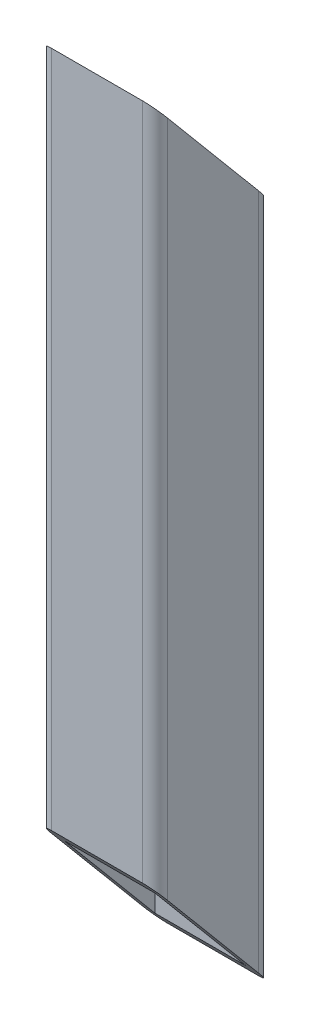
ISO-10303-21;
HEADER;
FILE_DESCRIPTION(('STEP AP214'),'2;1');
FILE_NAME('part.step','',(''),(''),'','','');
FILE_SCHEMA(('AUTOMOTIVE_DESIGN { 1 0 10303 214 1 1 1 1 }'));
ENDSEC;
DATA;
#1=APPLICATION_CONTEXT('core data for automotive mechanical design processes');
#2=APPLICATION_PROTOCOL_DEFINITION('international standard','automotive_design',2000,#1);
#3=PRODUCT_CONTEXT('',#1,'mechanical');
#4=PRODUCT('Part','Part','',(#3));
#5=PRODUCT_RELATED_PRODUCT_CATEGORY('part','',(#4));
#6=PRODUCT_DEFINITION_FORMATION('','',#4);
#7=PRODUCT_DEFINITION_CONTEXT('part definition',#1,'design');
#8=PRODUCT_DEFINITION('design','',#6,#7);
#9=PRODUCT_DEFINITION_SHAPE('','',#8);
#10=(LENGTH_UNIT() NAMED_UNIT(*) SI_UNIT(.MILLI.,.METRE.));
#11=(NAMED_UNIT(*) PLANE_ANGLE_UNIT() SI_UNIT($,.RADIAN.));
#12=(NAMED_UNIT(*) SI_UNIT($,.STERADIAN.) SOLID_ANGLE_UNIT());
#13=UNCERTAINTY_MEASURE_WITH_UNIT(LENGTH_MEASURE(1.E-05),#10,'distance_accuracy_value','');
#14=(GEOMETRIC_REPRESENTATION_CONTEXT(3) GLOBAL_UNCERTAINTY_ASSIGNED_CONTEXT((#13)) GLOBAL_UNIT_ASSIGNED_CONTEXT((#10,
#11,#12)) REPRESENTATION_CONTEXT('',''));
#15=CARTESIAN_POINT('',(0.,0.,0.));
#16=DIRECTION('',(0.,0.,1.));
#17=DIRECTION('',(1.,0.,0.));
#18=AXIS2_PLACEMENT_3D('',#15,#16,#17);
#19=CARTESIAN_POINT('',(22.8,180.,2.8));
#20=DIRECTION('',(0.,-1.,0.));
#21=DIRECTION('',(0.,0.,-1.));
#22=AXIS2_PLACEMENT_3D('',#19,#20,#21);
#23=CYLINDRICAL_SURFACE('',#22,2.8);
#24=CARTESIAN_POINT('',(22.8,152.816702139194,2.8));
#25=DIRECTION('',(0.,0.642630545799381,-0.766176207934957));
#26=DIRECTION('',(0.,-0.766176207934957,-0.642630545799381));
#27=AXIS2_PLACEMENT_3D('',#24,#25,#26);
#28=ELLIPSE('',#27,4.3570913619069,2.8);
#29=CARTESIAN_POINT('',(25.6,152.816702139194,2.80000000000002));
#30=VERTEX_POINT('',#29);
#31=CARTESIAN_POINT('',(22.8,149.478402401902,0.));
#32=VERTEX_POINT('',#31);
#33=EDGE_CURVE('E235',#30,#32,#28,.T.);
#34=ORIENTED_EDGE('',*,*,#33,.F.);
#35=DIRECTION('',(0.,-1.,0.));
#36=VECTOR('',#35,1.);
#37=CARTESIAN_POINT('',(25.6,180.,2.80000000000002));
#38=LINE('',#37,#36);
#39=CARTESIAN_POINT('',(25.6,3.33691005926381,2.80000000000004));
#40=VERTEX_POINT('',#39);
#41=EDGE_CURVE('E145',#30,#40,#38,.T.);
#42=ORIENTED_EDGE('',*,*,#41,.T.);
#43=CARTESIAN_POINT('',(22.8,3.33691005926376,2.8));
#44=DIRECTION('',(0.,-0.642787609686543,0.766044443118975));
#45=DIRECTION('',(0.,-0.766044443118975,-0.642787609686543));
#46=AXIS2_PLACEMENT_3D('',#43,#44,#45);
#47=ELLIPSE('',#46,4.35602671520913,2.8);
#48=CARTESIAN_POINT('',(22.8,0.,0.));
#49=VERTEX_POINT('',#48);
#50=EDGE_CURVE('E178',#49,#40,#47,.T.);
#51=ORIENTED_EDGE('',*,*,#50,.F.);
#52=DIRECTION('',(0.,-1.,0.));
#53=VECTOR('',#52,1.);
#54=CARTESIAN_POINT('',(22.8,180.,0.));
#55=LINE('',#54,#53);
#56=EDGE_CURVE('E41',#32,#49,#55,.T.);
#57=ORIENTED_EDGE('',*,*,#56,.F.);
#58=EDGE_LOOP('',(#34,#42,#51,#57));
#59=FACE_BOUND('',#58,.T.);
#60=ADVANCED_FACE('F34',(#59),#23,.T.);
#61=CARTESIAN_POINT('',(2.8,180.,2.8));
#62=DIRECTION('',(0.,-1.,0.));
#63=DIRECTION('',(0.,0.,-1.));
#64=AXIS2_PLACEMENT_3D('',#61,#62,#63);
#65=CYLINDRICAL_SURFACE('',#64,2.8);
#66=CARTESIAN_POINT('',(2.8,152.816702139194,2.8));
#67=DIRECTION('',(0.,0.642630545799381,-0.766176207934957));
#68=DIRECTION('',(0.,-0.766176207934957,-0.642630545799381));
#69=AXIS2_PLACEMENT_3D('',#66,#67,#68);
#70=ELLIPSE('',#69,4.3570913619069,2.8);
#71=CARTESIAN_POINT('',(2.80000000000002,149.478402401902,0.));
#72=VERTEX_POINT('',#71);
#73=CARTESIAN_POINT('',(0.,152.816702139194,2.80000000000002));
#74=VERTEX_POINT('',#73);
#75=EDGE_CURVE('E234',#72,#74,#70,.T.);
#76=ORIENTED_EDGE('',*,*,#75,.F.);
#77=DIRECTION('',(0.,-1.,0.));
#78=VECTOR('',#77,1.);
#79=CARTESIAN_POINT('',(2.80000000000002,180.,0.));
#80=LINE('',#79,#78);
#81=CARTESIAN_POINT('',(2.80000000000002,0.,0.));
#82=VERTEX_POINT('',#81);
#83=EDGE_CURVE('E162',#72,#82,#80,.T.);
#84=ORIENTED_EDGE('',*,*,#83,.T.);
#85=CARTESIAN_POINT('',(2.8,3.33691005926376,2.8));
#86=DIRECTION('',(0.,-0.642787609686543,0.766044443118975));
#87=DIRECTION('',(0.,-0.766044443118975,-0.642787609686543));
#88=AXIS2_PLACEMENT_3D('',#85,#86,#87);
#89=ELLIPSE('',#88,4.35602671520913,2.8);
#90=CARTESIAN_POINT('',(0.,3.33691005926381,2.80000000000004));
#91=VERTEX_POINT('',#90);
#92=EDGE_CURVE('E182',#91,#82,#89,.T.);
#93=ORIENTED_EDGE('',*,*,#92,.F.);
#94=DIRECTION('',(0.,-1.,0.));
#95=VECTOR('',#94,1.);
#96=CARTESIAN_POINT('',(0.,180.,2.80000000000002));
#97=LINE('',#96,#95);
#98=EDGE_CURVE('E160',#74,#91,#97,.T.);
#99=ORIENTED_EDGE('',*,*,#98,.F.);
#100=EDGE_LOOP('',(#76,#84,#93,#99));
#101=FACE_BOUND('',#100,.T.);
#102=ADVANCED_FACE('F232',(#101),#65,.T.);
#103=CARTESIAN_POINT('',(0.,180.,2.80000000000002));
#104=DIRECTION('',(1.,0.,0.));
#105=DIRECTION('',(0.,0.,-1.));
#106=AXIS2_PLACEMENT_3D('',#103,#104,#105);
#107=PLANE('',#106);
#108=DIRECTION('',(0.,0.766176207934957,0.642630545799381));
#109=VECTOR('',#108,1.);
#110=CARTESIAN_POINT('',(0.,168.774004249211,16.1841923806075));
#111=LINE('',#110,#109);
#112=CARTESIAN_POINT('',(0.,176.661700262708,22.8));
#113=VERTEX_POINT('',#112);
#114=EDGE_CURVE('E48',#74,#113,#111,.T.);
#115=ORIENTED_EDGE('',*,*,#114,.F.);
#116=ORIENTED_EDGE('',*,*,#98,.T.);
#117=DIRECTION('',(0.,-0.766044443118975,-0.642787609686543));
#118=VECTOR('',#117,1.);
#119=CARTESIAN_POINT('',(0.,107.00706684424,89.7895903223652));
#120=LINE('',#119,#118);
#121=CARTESIAN_POINT('',(0.,27.1719819111478,22.8));
#122=VERTEX_POINT('',#121);
#123=EDGE_CURVE('E186',#122,#91,#120,.T.);
#124=ORIENTED_EDGE('',*,*,#123,.F.);
#125=DIRECTION('',(0.,-1.,0.));
#126=VECTOR('',#125,1.);
#127=CARTESIAN_POINT('',(0.,180.,22.8));
#128=LINE('',#127,#126);
#129=EDGE_CURVE('E158',#113,#122,#128,.T.);
#130=ORIENTED_EDGE('',*,*,#129,.F.);
#131=EDGE_LOOP('',(#115,#116,#124,#130));
#132=FACE_BOUND('',#131,.T.);
#133=ADVANCED_FACE('F266',(#132),#107,.F.);
#134=CARTESIAN_POINT('',(2.8,180.,22.8));
#135=DIRECTION('',(0.,-1.,0.));
#136=DIRECTION('',(0.,0.,-1.));
#137=AXIS2_PLACEMENT_3D('',#134,#135,#136);
#138=CYLINDRICAL_SURFACE('',#137,2.8);
#139=CARTESIAN_POINT('',(2.8,176.661700262708,22.8));
#140=DIRECTION('',(0.,0.642630545799381,-0.766176207934957));
#141=DIRECTION('',(0.,-0.766176207934957,-0.642630545799381));
#142=AXIS2_PLACEMENT_3D('',#139,#140,#141);
#143=ELLIPSE('',#142,4.3570913619069,2.8);
#144=CARTESIAN_POINT('',(2.80000000000002,180.,25.6));
#145=VERTEX_POINT('',#144);
#146=EDGE_CURVE('E56',#113,#145,#143,.T.);
#147=ORIENTED_EDGE('',*,*,#146,.F.);
#148=ORIENTED_EDGE('',*,*,#129,.T.);
#149=CARTESIAN_POINT('',(2.8,27.1719819111478,22.8));
#150=DIRECTION('',(0.,-0.642787609686543,0.766044443118975));
#151=DIRECTION('',(0.,-0.766044443118975,-0.642787609686543));
#152=AXIS2_PLACEMENT_3D('',#149,#150,#151);
#153=ELLIPSE('',#152,4.35602671520913,2.8);
#154=CARTESIAN_POINT('',(2.80000000000002,30.5088919704115,25.6));
#155=VERTEX_POINT('',#154);
#156=EDGE_CURVE('E227',#155,#122,#153,.T.);
#157=ORIENTED_EDGE('',*,*,#156,.F.);
#158=DIRECTION('',(0.,-1.,0.));
#159=VECTOR('',#158,1.);
#160=CARTESIAN_POINT('',(2.80000000000002,180.,25.6));
#161=LINE('',#160,#159);
#162=EDGE_CURVE('E132',#145,#155,#161,.T.);
#163=ORIENTED_EDGE('',*,*,#162,.F.);
#164=EDGE_LOOP('',(#147,#148,#157,#163));
#165=FACE_BOUND('',#164,.T.);
#166=ADVANCED_FACE('F271',(#165),#138,.T.);
#167=CARTESIAN_POINT('',(22.8,180.,22.8));
#168=DIRECTION('',(0.,-1.,0.));
#169=DIRECTION('',(0.,0.,-1.));
#170=AXIS2_PLACEMENT_3D('',#167,#168,#169);
#171=CYLINDRICAL_SURFACE('',#170,2.8);
#172=CARTESIAN_POINT('',(22.8,176.661700262708,22.8));
#173=DIRECTION('',(0.,0.642630545799381,-0.766176207934957));
#174=DIRECTION('',(0.,-0.766176207934957,-0.642630545799381));
#175=AXIS2_PLACEMENT_3D('',#172,#173,#174);
#176=ELLIPSE('',#175,4.3570913619069,2.8);
#177=CARTESIAN_POINT('',(22.8,180.,25.6));
#178=VERTEX_POINT('',#177);
#179=CARTESIAN_POINT('',(25.6,176.661700262708,22.8));
#180=VERTEX_POINT('',#179);
#181=EDGE_CURVE('E137',#178,#180,#176,.T.);
#182=ORIENTED_EDGE('',*,*,#181,.F.);
#183=DIRECTION('',(0.,-1.,0.));
#184=VECTOR('',#183,1.);
#185=CARTESIAN_POINT('',(22.8,180.,25.6));
#186=LINE('',#185,#184);
#187=CARTESIAN_POINT('',(22.8,30.5088919704115,25.6));
#188=VERTEX_POINT('',#187);
#189=EDGE_CURVE('E123',#178,#188,#186,.T.);
#190=ORIENTED_EDGE('',*,*,#189,.T.);
#191=CARTESIAN_POINT('',(22.8,27.1719819111478,22.8));
#192=DIRECTION('',(0.,-0.642787609686543,0.766044443118975));
#193=DIRECTION('',(0.,-0.766044443118975,-0.642787609686543));
#194=AXIS2_PLACEMENT_3D('',#191,#192,#193);
#195=ELLIPSE('',#194,4.35602671520913,2.8);
#196=CARTESIAN_POINT('',(25.6,27.1719819111477,22.8));
#197=VERTEX_POINT('',#196);
#198=EDGE_CURVE('E224',#197,#188,#195,.T.);
#199=ORIENTED_EDGE('',*,*,#198,.F.);
#200=DIRECTION('',(0.,-1.,0.));
#201=VECTOR('',#200,1.);
#202=CARTESIAN_POINT('',(25.6,180.,22.8));
#203=LINE('',#202,#201);
#204=EDGE_CURVE('E133',#180,#197,#203,.T.);
#205=ORIENTED_EDGE('',*,*,#204,.F.);
#206=EDGE_LOOP('',(#182,#190,#199,#205));
#207=FACE_BOUND('',#206,.T.);
#208=ADVANCED_FACE('F138',(#207),#171,.T.);
#209=CARTESIAN_POINT('',(25.6,180.,2.80000000000002));
#210=DIRECTION('',(-1.,0.,0.));
#211=DIRECTION('',(0.,0.,1.));
#212=AXIS2_PLACEMENT_3D('',#209,#210,#211);
#213=PLANE('',#212);
#214=DIRECTION('',(0.,-0.766176207934957,-0.642630545799381));
#215=VECTOR('',#214,1.);
#216=CARTESIAN_POINT('',(25.6,168.774004249211,16.1841923806075));
#217=LINE('',#216,#215);
#218=EDGE_CURVE('E141',#180,#30,#217,.T.);
#219=ORIENTED_EDGE('',*,*,#218,.F.);
#220=ORIENTED_EDGE('',*,*,#204,.T.);
#221=DIRECTION('',(0.,0.766044443118975,0.642787609686543));
#222=VECTOR('',#221,1.);
#223=CARTESIAN_POINT('',(25.6,107.00706684424,89.7895903223652));
#224=LINE('',#223,#222);
#225=EDGE_CURVE('E222',#40,#197,#224,.T.);
#226=ORIENTED_EDGE('',*,*,#225,.F.);
#227=ORIENTED_EDGE('',*,*,#41,.F.);
#228=EDGE_LOOP('',(#219,#220,#226,#227));
#229=FACE_BOUND('',#228,.T.);
#230=ADVANCED_FACE('F252',(#229),#213,.F.);
#231=CARTESIAN_POINT('',(22.8,1040.5,2.8));
#232=DIRECTION('',(1.,0.,0.));
#233=DIRECTION('',(0.,0.,-1.));
#234=AXIS2_PLACEMENT_3D('',#231,#232,#233);
#235=PLANE('',#234);
#236=DIRECTION('',(0.,0.766176207934957,0.642630545799381));
#237=VECTOR('',#236,1.);
#238=CARTESIAN_POINT('',(22.7999999999998,673.909861420821,439.867058325967));
#239=LINE('',#238,#237);
#240=CARTESIAN_POINT('',(22.8,152.816702139194,2.8));
#241=VERTEX_POINT('',#240);
#242=CARTESIAN_POINT('',(22.8,176.661700262708,22.8));
#243=VERTEX_POINT('',#242);
#244=EDGE_CURVE('E212',#241,#243,#239,.T.);
#245=ORIENTED_EDGE('',*,*,#244,.F.);
#246=DIRECTION('',(0.,-1.,0.));
#247=VECTOR('',#246,1.);
#248=CARTESIAN_POINT('',(22.8,1040.5,2.8));
#249=LINE('',#248,#247);
#250=CARTESIAN_POINT('',(22.8,3.33691005926373,2.8));
#251=VERTEX_POINT('',#250);
#252=EDGE_CURVE('E150',#241,#251,#249,.T.);
#253=ORIENTED_EDGE('',*,*,#252,.T.);
#254=DIRECTION('',(0.,-0.766044443118975,-0.642787609686543));
#255=VECTOR('',#254,1.);
#256=CARTESIAN_POINT('',(22.7999999999998,611.969195285433,513.503126055868));
#257=LINE('',#256,#255);
#258=CARTESIAN_POINT('',(22.8,27.1719819111478,22.8));
#259=VERTEX_POINT('',#258);
#260=EDGE_CURVE('E214',#259,#251,#257,.T.);
#261=ORIENTED_EDGE('',*,*,#260,.F.);
#262=DIRECTION('',(0.,-1.,0.));
#263=VECTOR('',#262,1.);
#264=CARTESIAN_POINT('',(22.8,1040.5,22.8));
#265=LINE('',#264,#263);
#266=EDGE_CURVE('E153',#243,#259,#265,.T.);
#267=ORIENTED_EDGE('',*,*,#266,.F.);
#268=EDGE_LOOP('',(#245,#253,#261,#267));
#269=FACE_BOUND('',#268,.T.);
#270=ADVANCED_FACE('F250',(#269),#235,.F.);
#271=CARTESIAN_POINT('',(2.8,1040.5,2.8));
#272=DIRECTION('',(0.,0.,-1.));
#273=DIRECTION('',(-1.,0.,0.));
#274=AXIS2_PLACEMENT_3D('',#271,#272,#273);
#275=PLANE('',#274);
#276=DIRECTION('',(1.,0.,0.));
#277=VECTOR('',#276,1.);
#278=CARTESIAN_POINT('',(2.80000000000016,152.816702139194,2.8));
#279=LINE('',#278,#277);
#280=CARTESIAN_POINT('',(2.8,152.816702139194,2.79999999999993));
#281=VERTEX_POINT('',#280);
#282=EDGE_CURVE('E217',#281,#241,#279,.T.);
#283=ORIENTED_EDGE('',*,*,#282,.F.);
#284=DIRECTION('',(0.,-1.,0.));
#285=VECTOR('',#284,1.);
#286=CARTESIAN_POINT('',(2.8,1040.5,2.8));
#287=LINE('',#286,#285);
#288=CARTESIAN_POINT('',(2.8,3.33691005926373,2.80000000000001));
#289=VERTEX_POINT('',#288);
#290=EDGE_CURVE('E191',#281,#289,#287,.T.);
#291=ORIENTED_EDGE('',*,*,#290,.T.);
#292=DIRECTION('',(-1.,0.,0.));
#293=VECTOR('',#292,1.);
#294=CARTESIAN_POINT('',(2.80000000000019,3.33691005926373,2.8));
#295=LINE('',#294,#293);
#296=EDGE_CURVE('E211',#251,#289,#295,.T.);
#297=ORIENTED_EDGE('',*,*,#296,.F.);
#298=ORIENTED_EDGE('',*,*,#252,.F.);
#299=EDGE_LOOP('',(#283,#291,#297,#298));
#300=FACE_BOUND('',#299,.T.);
#301=ADVANCED_FACE('F248',(#300),#275,.F.);
#302=CARTESIAN_POINT('',(2.8,1040.5,2.8));
#303=DIRECTION('',(-1.,0.,0.));
#304=DIRECTION('',(0.,0.,1.));
#305=AXIS2_PLACEMENT_3D('',#302,#303,#304);
#306=PLANE('',#305);
#307=DIRECTION('',(0.,-0.766176207934957,-0.642630545799381));
#308=VECTOR('',#307,1.);
#309=CARTESIAN_POINT('',(2.79999999999986,673.909861420821,439.867058325967));
#310=LINE('',#309,#308);
#311=CARTESIAN_POINT('',(2.8,176.661700262708,22.8));
#312=VERTEX_POINT('',#311);
#313=EDGE_CURVE('E202',#312,#281,#310,.T.);
#314=ORIENTED_EDGE('',*,*,#313,.F.);
#315=DIRECTION('',(0.,-1.,0.));
#316=VECTOR('',#315,1.);
#317=CARTESIAN_POINT('',(2.8,1040.5,22.8));
#318=LINE('',#317,#316);
#319=CARTESIAN_POINT('',(2.8,27.1719819111478,22.8));
#320=VERTEX_POINT('',#319);
#321=EDGE_CURVE('E185',#312,#320,#318,.T.);
#322=ORIENTED_EDGE('',*,*,#321,.T.);
#323=DIRECTION('',(0.,0.766044443118975,0.642787609686543));
#324=VECTOR('',#323,1.);
#325=CARTESIAN_POINT('',(2.79999999999984,611.969195285433,513.503126055868));
#326=LINE('',#325,#324);
#327=EDGE_CURVE('E199',#289,#320,#326,.T.);
#328=ORIENTED_EDGE('',*,*,#327,.F.);
#329=ORIENTED_EDGE('',*,*,#290,.F.);
#330=EDGE_LOOP('',(#314,#322,#328,#329));
#331=FACE_BOUND('',#330,.T.);
#332=ADVANCED_FACE('F196',(#331),#306,.F.);
#333=CARTESIAN_POINT('',(2.8,1040.5,22.8));
#334=DIRECTION('',(0.,0.,1.));
#335=DIRECTION('',(1.,0.,0.));
#336=AXIS2_PLACEMENT_3D('',#333,#334,#335);
#337=PLANE('',#336);
#338=DIRECTION('',(-1.,0.,0.));
#339=VECTOR('',#338,1.);
#340=CARTESIAN_POINT('',(2.80000000000017,176.661700262708,22.8));
#341=LINE('',#340,#339);
#342=EDGE_CURVE('E243',#243,#312,#341,.T.);
#343=ORIENTED_EDGE('',*,*,#342,.F.);
#344=ORIENTED_EDGE('',*,*,#266,.T.);
#345=DIRECTION('',(1.,0.,0.));
#346=VECTOR('',#345,1.);
#347=CARTESIAN_POINT('',(2.8000000000002,27.1719819111478,22.8));
#348=LINE('',#347,#346);
#349=EDGE_CURVE('E11',#320,#259,#348,.T.);
#350=ORIENTED_EDGE('',*,*,#349,.F.);
#351=ORIENTED_EDGE('',*,*,#321,.F.);
#352=EDGE_LOOP('',(#343,#344,#350,#351));
#353=FACE_BOUND('',#352,.T.);
#354=ADVANCED_FACE('F205',(#353),#337,.F.);
#355=CARTESIAN_POINT('',(2.80000000000002,180.,0.));
#356=DIRECTION('',(0.,0.,1.));
#357=DIRECTION('',(1.,0.,0.));
#358=AXIS2_PLACEMENT_3D('',#355,#356,#357);
#359=PLANE('',#358);
#360=DIRECTION('',(-1.,0.,0.));
#361=VECTOR('',#360,1.);
#362=CARTESIAN_POINT('',(2.80000000000002,149.478402401902,0.));
#363=LINE('',#362,#361);
#364=EDGE_CURVE('E169',#32,#72,#363,.T.);
#365=ORIENTED_EDGE('',*,*,#364,.F.);
#366=ORIENTED_EDGE('',*,*,#56,.T.);
#367=DIRECTION('',(-1.,0.,0.));
#368=VECTOR('',#367,1.);
#369=CARTESIAN_POINT('',(2.80000000000002,0.,0.));
#370=LINE('',#369,#368);
#371=EDGE_CURVE('E146',#49,#82,#370,.T.);
#372=ORIENTED_EDGE('',*,*,#371,.T.);
#373=ORIENTED_EDGE('',*,*,#83,.F.);
#374=EDGE_LOOP('',(#365,#366,#372,#373));
#375=FACE_BOUND('',#374,.T.);
#376=ADVANCED_FACE('F166',(#375),#359,.F.);
#377=CARTESIAN_POINT('',(2.80000000000002,180.,25.6));
#378=DIRECTION('',(0.,0.,-1.));
#379=DIRECTION('',(-1.,0.,0.));
#380=AXIS2_PLACEMENT_3D('',#377,#378,#379);
#381=PLANE('',#380);
#382=DIRECTION('',(-1.,0.,0.));
#383=VECTOR('',#382,1.);
#384=CARTESIAN_POINT('',(2.80000000000002,30.5088919704115,25.6));
#385=LINE('',#384,#383);
#386=EDGE_CURVE('E129',#188,#155,#385,.T.);
#387=ORIENTED_EDGE('',*,*,#386,.F.);
#388=ORIENTED_EDGE('',*,*,#189,.F.);
#389=DIRECTION('',(1.,0.,0.));
#390=VECTOR('',#389,1.);
#391=CARTESIAN_POINT('',(2.80000000000002,180.,25.6));
#392=LINE('',#391,#390);
#393=EDGE_CURVE('E128',#145,#178,#392,.T.);
#394=ORIENTED_EDGE('',*,*,#393,.F.);
#395=ORIENTED_EDGE('',*,*,#162,.T.);
#396=EDGE_LOOP('',(#387,#388,#394,#395));
#397=FACE_BOUND('',#396,.T.);
#398=ADVANCED_FACE('F125',(#397),#381,.F.);
#399=CARTESIAN_POINT('',(258.005991207201,0.,0.));
#400=DIRECTION('',(0.,-0.642787609686543,0.766044443118975));
#401=DIRECTION('',(0.,-0.766044443118975,-0.642787609686543));
#402=AXIS2_PLACEMENT_3D('',#399,#400,#401);
#403=PLANE('',#402);
#404=ORIENTED_EDGE('',*,*,#349,.T.);
#405=ORIENTED_EDGE('',*,*,#260,.T.);
#406=ORIENTED_EDGE('',*,*,#296,.T.);
#407=ORIENTED_EDGE('',*,*,#327,.T.);
#408=EDGE_LOOP('',(#404,#405,#406,#407));
#409=FACE_BOUND('',#408,.T.);
#410=ORIENTED_EDGE('',*,*,#371,.F.);
#411=ORIENTED_EDGE('',*,*,#50,.T.);
#412=ORIENTED_EDGE('',*,*,#225,.T.);
#413=ORIENTED_EDGE('',*,*,#198,.T.);
#414=ORIENTED_EDGE('',*,*,#386,.T.);
#415=ORIENTED_EDGE('',*,*,#156,.T.);
#416=ORIENTED_EDGE('',*,*,#123,.T.);
#417=ORIENTED_EDGE('',*,*,#92,.T.);
#418=EDGE_LOOP('',(#410,#411,#412,#413,#414,#415,#416,#417));
#419=FACE_BOUND('',#418,.T.);
#420=ADVANCED_FACE('F176',(#409,#419),#403,.T.);
#421=CARTESIAN_POINT('',(258.005991207201,180.,25.6));
#422=DIRECTION('',(0.,0.642630545799381,-0.766176207934957));
#423=DIRECTION('',(0.,0.766176207934957,0.642630545799381));
#424=AXIS2_PLACEMENT_3D('',#421,#422,#423);
#425=PLANE('',#424);
#426=ORIENTED_EDGE('',*,*,#114,.T.);
#427=ORIENTED_EDGE('',*,*,#146,.T.);
#428=ORIENTED_EDGE('',*,*,#393,.T.);
#429=ORIENTED_EDGE('',*,*,#181,.T.);
#430=ORIENTED_EDGE('',*,*,#218,.T.);
#431=ORIENTED_EDGE('',*,*,#33,.T.);
#432=ORIENTED_EDGE('',*,*,#364,.T.);
#433=ORIENTED_EDGE('',*,*,#75,.T.);
#434=EDGE_LOOP('',(#426,#427,#428,#429,#430,#431,#432,#433));
#435=FACE_BOUND('',#434,.T.);
#436=ORIENTED_EDGE('',*,*,#282,.T.);
#437=ORIENTED_EDGE('',*,*,#244,.T.);
#438=ORIENTED_EDGE('',*,*,#342,.T.);
#439=ORIENTED_EDGE('',*,*,#313,.T.);
#440=EDGE_LOOP('',(#436,#437,#438,#439));
#441=FACE_BOUND('',#440,.T.);
#442=ADVANCED_FACE('F143',(#435,#441),#425,.T.);
#443=CLOSED_SHELL('',(#60,#102,#133,#166,#208,#230,#270,#301,#332,#354,#376,#398,#420,#442));
#444=MANIFOLD_SOLID_BREP('B2',#443);
#445=ADVANCED_BREP_SHAPE_REPRESENTATION('',(#18,#444),#14);
#446=SHAPE_DEFINITION_REPRESENTATION(#9,#445);
ENDSEC;
END-ISO-10303-21;
